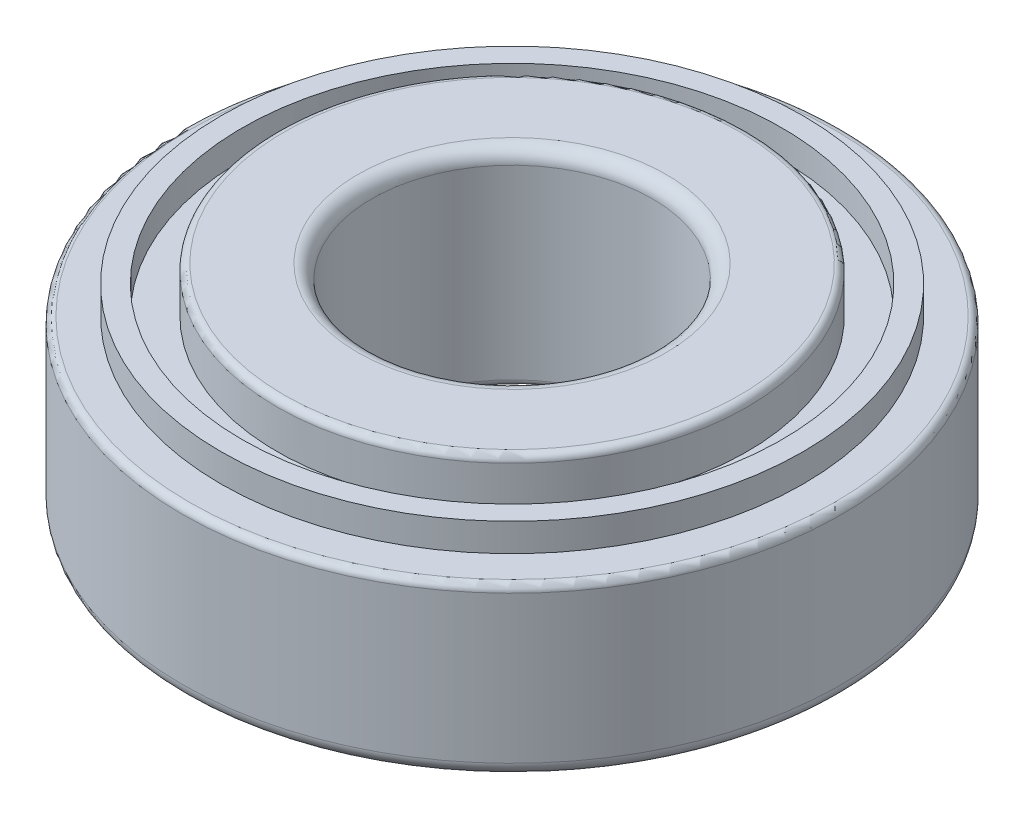
ISO-10303-21;
HEADER;
FILE_DESCRIPTION(('STEP AP214'),'2;1');
FILE_NAME('part.step','',(''),(''),'','','');
FILE_SCHEMA(('AUTOMOTIVE_DESIGN { 1 0 10303 214 1 1 1 1 }'));
ENDSEC;
DATA;
#1=APPLICATION_CONTEXT('core data for automotive mechanical design processes');
#2=APPLICATION_PROTOCOL_DEFINITION('international standard','automotive_design',2000,#1);
#3=PRODUCT_CONTEXT('',#1,'mechanical');
#4=PRODUCT('Part','Part','',(#3));
#5=PRODUCT_RELATED_PRODUCT_CATEGORY('part','',(#4));
#6=PRODUCT_DEFINITION_FORMATION('','',#4);
#7=PRODUCT_DEFINITION_CONTEXT('part definition',#1,'design');
#8=PRODUCT_DEFINITION('design','',#6,#7);
#9=PRODUCT_DEFINITION_SHAPE('','',#8);
#10=(LENGTH_UNIT() NAMED_UNIT(*) SI_UNIT(.MILLI.,.METRE.));
#11=(NAMED_UNIT(*) PLANE_ANGLE_UNIT() SI_UNIT($,.RADIAN.));
#12=(NAMED_UNIT(*) SI_UNIT($,.STERADIAN.) SOLID_ANGLE_UNIT());
#13=UNCERTAINTY_MEASURE_WITH_UNIT(LENGTH_MEASURE(1.E-05),#10,'distance_accuracy_value','');
#14=(GEOMETRIC_REPRESENTATION_CONTEXT(3) GLOBAL_UNCERTAINTY_ASSIGNED_CONTEXT((#13)) GLOBAL_UNIT_ASSIGNED_CONTEXT((#10,
#11,#12)) REPRESENTATION_CONTEXT('',''));
#15=CARTESIAN_POINT('',(0.,0.,0.));
#16=DIRECTION('',(0.,0.,1.));
#17=DIRECTION('',(1.,0.,0.));
#18=AXIS2_PLACEMENT_3D('',#15,#16,#17);
#19=CARTESIAN_POINT('',(0.,12.,0.));
#20=DIRECTION('',(0.,1.,0.));
#21=DIRECTION('',(0.,0.,1.));
#22=AXIS2_PLACEMENT_3D('',#19,#20,#21);
#23=PLANE('',#22);
#24=CARTESIAN_POINT('',(0.,12.,0.));
#25=DIRECTION('',(0.,1.,0.));
#26=DIRECTION('',(0.,0.,1.));
#27=AXIS2_PLACEMENT_3D('',#24,#25,#26);
#28=CIRCLE('',#27,16.75);
#29=CARTESIAN_POINT('',(0.,12.,-16.75));
#30=VERTEX_POINT('',#29);
#31=EDGE_CURVE('E73',#30,#30,#28,.T.);
#32=ORIENTED_EDGE('',*,*,#31,.F.);
#33=EDGE_LOOP('',(#32));
#34=FACE_BOUND('',#33,.T.);
#35=CARTESIAN_POINT('',(0.,12.,0.));
#36=DIRECTION('',(0.,1.,0.));
#37=DIRECTION('',(0.,0.,1.));
#38=AXIS2_PLACEMENT_3D('',#35,#36,#37);
#39=CIRCLE('',#38,19.25);
#40=CARTESIAN_POINT('',(0.,12.,19.25));
#41=VERTEX_POINT('',#40);
#42=EDGE_CURVE('E70',#41,#41,#39,.F.);
#43=ORIENTED_EDGE('',*,*,#42,.F.);
#44=EDGE_LOOP('',(#43));
#45=FACE_BOUND('',#44,.T.);
#46=ADVANCED_FACE('F32',(#34,#45),#23,.T.);
#47=CARTESIAN_POINT('',(0.,12.,0.));
#48=DIRECTION('',(0.,-1.,0.));
#49=DIRECTION('',(0.,0.,-1.));
#50=AXIS2_PLACEMENT_3D('',#47,#48,#49);
#51=CYLINDRICAL_SURFACE('',#50,23.5);
#52=CARTESIAN_POINT('',(0.,11.5,0.));
#53=DIRECTION('',(0.,1.,0.));
#54=DIRECTION('',(0.,0.,1.));
#55=AXIS2_PLACEMENT_3D('',#52,#53,#54);
#56=CIRCLE('',#55,23.5);
#57=CARTESIAN_POINT('',(0.,11.5,23.5));
#58=VERTEX_POINT('',#57);
#59=EDGE_CURVE('E43',#58,#58,#56,.F.);
#60=ORIENTED_EDGE('',*,*,#59,.T.);
#61=EDGE_LOOP('',(#60));
#62=FACE_BOUND('',#61,.T.);
#63=CARTESIAN_POINT('',(0.,1.,0.));
#64=DIRECTION('',(0.,1.,0.));
#65=DIRECTION('',(0.,0.,1.));
#66=AXIS2_PLACEMENT_3D('',#63,#64,#65);
#67=CIRCLE('',#66,23.5);
#68=CARTESIAN_POINT('',(0.,1.,23.5));
#69=VERTEX_POINT('',#68);
#70=EDGE_CURVE('E67',#69,#69,#67,.T.);
#71=ORIENTED_EDGE('',*,*,#70,.T.);
#72=EDGE_LOOP('',(#71));
#73=FACE_BOUND('',#72,.T.);
#74=ADVANCED_FACE('F117',(#62,#73),#51,.T.);
#75=CARTESIAN_POINT('',(0.,12.,0.));
#76=DIRECTION('',(0.,1.,0.));
#77=DIRECTION('',(0.,0.,1.));
#78=AXIS2_PLACEMENT_3D('',#75,#76,#77);
#79=CIRCLE('',#78,23.);
#80=CARTESIAN_POINT('',(0.,12.,23.));
#81=VERTEX_POINT('',#80);
#82=EDGE_CURVE('E47',#81,#81,#79,.T.);
#83=ORIENTED_EDGE('',*,*,#82,.T.);
#84=EDGE_LOOP('',(#83));
#85=FACE_BOUND('',#84,.T.);
#86=CARTESIAN_POINT('',(0.,12.,0.));
#87=DIRECTION('',(0.,1.,0.));
#88=DIRECTION('',(0.,0.,1.));
#89=AXIS2_PLACEMENT_3D('',#86,#87,#88);
#90=CIRCLE('',#89,20.75);
#91=CARTESIAN_POINT('',(0.,12.,20.75));
#92=VERTEX_POINT('',#91);
#93=EDGE_CURVE('E77',#92,#92,#90,.T.);
#94=ORIENTED_EDGE('',*,*,#93,.F.);
#95=EDGE_LOOP('',(#94));
#96=FACE_BOUND('',#95,.T.);
#97=ADVANCED_FACE('F105',(#85,#96),#23,.T.);
#98=CARTESIAN_POINT('',(0.,0.,0.));
#99=DIRECTION('',(0.,1.,0.));
#100=DIRECTION('',(0.,0.,1.));
#101=AXIS2_PLACEMENT_3D('',#98,#99,#100);
#102=PLANE('',#101);
#103=CARTESIAN_POINT('',(0.,0.,0.));
#104=DIRECTION('',(0.,-1.,0.));
#105=DIRECTION('',(0.,0.,-1.));
#106=AXIS2_PLACEMENT_3D('',#103,#104,#105);
#107=CIRCLE('',#106,18.5);
#108=CARTESIAN_POINT('',(0.,0.,-18.5));
#109=VERTEX_POINT('',#108);
#110=EDGE_CURVE('E86',#109,#109,#107,.T.);
#111=ORIENTED_EDGE('',*,*,#110,.F.);
#112=EDGE_LOOP('',(#111));
#113=FACE_BOUND('',#112,.T.);
#114=CARTESIAN_POINT('',(0.,0.,0.));
#115=DIRECTION('',(0.,1.,0.));
#116=DIRECTION('',(0.,0.,1.));
#117=AXIS2_PLACEMENT_3D('',#114,#115,#116);
#118=CIRCLE('',#117,22.5);
#119=CARTESIAN_POINT('',(0.,0.,22.5));
#120=VERTEX_POINT('',#119);
#121=EDGE_CURVE('E64',#120,#120,#118,.F.);
#122=ORIENTED_EDGE('',*,*,#121,.T.);
#123=EDGE_LOOP('',(#122));
#124=FACE_BOUND('',#123,.T.);
#125=ADVANCED_FACE('F101',(#113,#124),#102,.F.);
#126=CARTESIAN_POINT('',(0.,15.25,0.));
#127=DIRECTION('',(0.,-1.,0.));
#128=DIRECTION('',(0.,0.,-1.));
#129=AXIS2_PLACEMENT_3D('',#126,#127,#128);
#130=CYLINDRICAL_SURFACE('',#129,16.75);
#131=CARTESIAN_POINT('',(0.,14.75,0.));
#132=DIRECTION('',(0.,1.,0.));
#133=DIRECTION('',(0.,0.,1.));
#134=AXIS2_PLACEMENT_3D('',#131,#132,#133);
#135=CIRCLE('',#134,16.75);
#136=CARTESIAN_POINT('',(0.,14.75,-16.75));
#137=VERTEX_POINT('',#136);
#138=EDGE_CURVE('E52',#137,#137,#135,.F.);
#139=CARTESIAN_POINT('',(0.,14.75,-16.75));
#140=CARTESIAN_POINT('',(0.,14.7213541666667,-16.75));
#141=CARTESIAN_POINT('',(0.,14.6927083333333,-16.75));
#142=CARTESIAN_POINT('',(0.,14.6354166666667,-16.75));
#143=CARTESIAN_POINT('',(0.,14.6067708333333,-16.75));
#144=CARTESIAN_POINT('',(0.,14.5494791666667,-16.75));
#145=CARTESIAN_POINT('',(0.,14.5208333333333,-16.75));
#146=CARTESIAN_POINT('',(0.,14.4635416666667,-16.75));
#147=CARTESIAN_POINT('',(0.,14.4348958333333,-16.75));
#148=CARTESIAN_POINT('',(0.,14.3776041666667,-16.75));
#149=CARTESIAN_POINT('',(0.,14.3489583333333,-16.75));
#150=CARTESIAN_POINT('',(0.,14.2916666666667,-16.75));
#151=CARTESIAN_POINT('',(0.,14.2630208333333,-16.75));
#152=CARTESIAN_POINT('',(0.,14.2057291666667,-16.75));
#153=CARTESIAN_POINT('',(0.,14.1770833333333,-16.75));
#154=CARTESIAN_POINT('',(0.,14.1197916666667,-16.75));
#155=CARTESIAN_POINT('',(0.,14.0911458333333,-16.75));
#156=CARTESIAN_POINT('',(0.,14.0338541666667,-16.75));
#157=CARTESIAN_POINT('',(0.,14.0052083333333,-16.75));
#158=CARTESIAN_POINT('',(0.,13.9479166666667,-16.75));
#159=CARTESIAN_POINT('',(0.,13.9192708333333,-16.75));
#160=CARTESIAN_POINT('',(0.,13.8619791666667,-16.75));
#161=CARTESIAN_POINT('',(0.,13.8333333333333,-16.75));
#162=CARTESIAN_POINT('',(0.,13.7760416666667,-16.75));
#163=CARTESIAN_POINT('',(0.,13.7473958333333,-16.75));
#164=CARTESIAN_POINT('',(0.,13.6901041666667,-16.75));
#165=CARTESIAN_POINT('',(0.,13.6614583333333,-16.75));
#166=CARTESIAN_POINT('',(0.,13.6041666666667,-16.75));
#167=CARTESIAN_POINT('',(0.,13.5755208333333,-16.75));
#168=CARTESIAN_POINT('',(0.,13.5182291666667,-16.75));
#169=CARTESIAN_POINT('',(0.,13.4895833333333,-16.75));
#170=CARTESIAN_POINT('',(0.,13.4322916666667,-16.75));
#171=CARTESIAN_POINT('',(0.,13.4036458333333,-16.75));
#172=CARTESIAN_POINT('',(0.,13.3463541666667,-16.75));
#173=CARTESIAN_POINT('',(0.,13.3177083333333,-16.75));
#174=CARTESIAN_POINT('',(0.,13.2604166666667,-16.75));
#175=CARTESIAN_POINT('',(0.,13.2317708333333,-16.75));
#176=CARTESIAN_POINT('',(0.,13.1744791666667,-16.75));
#177=CARTESIAN_POINT('',(0.,13.1458333333333,-16.75));
#178=CARTESIAN_POINT('',(0.,13.0885416666667,-16.75));
#179=CARTESIAN_POINT('',(0.,13.0598958333333,-16.75));
#180=CARTESIAN_POINT('',(0.,13.0026041666667,-16.75));
#181=CARTESIAN_POINT('',(0.,12.9739583333333,-16.75));
#182=CARTESIAN_POINT('',(0.,12.9166666666667,-16.75));
#183=CARTESIAN_POINT('',(0.,12.8880208333333,-16.75));
#184=CARTESIAN_POINT('',(0.,12.8307291666667,-16.75));
#185=CARTESIAN_POINT('',(0.,12.8020833333333,-16.75));
#186=CARTESIAN_POINT('',(0.,12.7447916666667,-16.75));
#187=CARTESIAN_POINT('',(0.,12.7161458333333,-16.75));
#188=CARTESIAN_POINT('',(0.,12.6588541666667,-16.75));
#189=CARTESIAN_POINT('',(0.,12.6302083333333,-16.75));
#190=CARTESIAN_POINT('',(0.,12.5729166666667,-16.75));
#191=CARTESIAN_POINT('',(0.,12.5442708333333,-16.75));
#192=CARTESIAN_POINT('',(0.,12.4869791666667,-16.75));
#193=CARTESIAN_POINT('',(0.,12.4583333333333,-16.75));
#194=CARTESIAN_POINT('',(0.,12.4010416666667,-16.75));
#195=CARTESIAN_POINT('',(0.,12.3723958333333,-16.75));
#196=CARTESIAN_POINT('',(0.,12.3151041666667,-16.75));
#197=CARTESIAN_POINT('',(0.,12.2864583333333,-16.75));
#198=CARTESIAN_POINT('',(0.,12.2291666666667,-16.75));
#199=CARTESIAN_POINT('',(0.,12.2005208333333,-16.75));
#200=CARTESIAN_POINT('',(0.,12.1432291666667,-16.75));
#201=CARTESIAN_POINT('',(0.,12.1145833333333,-16.75));
#202=CARTESIAN_POINT('',(0.,12.0572916666667,-16.75));
#203=CARTESIAN_POINT('',(0.,12.0286458333333,-16.75));
#204=CARTESIAN_POINT('',(0.,12.,-16.75));
#205=B_SPLINE_CURVE_WITH_KNOTS('',3,(#139,#140,#141,#142,#143,#144,#145,#146,#147,#148,#149,
#150,#151,#152,#153,#154,#155,#156,#157,#158,#159,#160,#161,#162,#163,#164,#165,#166,#167,#168,
#169,#170,#171,#172,#173,#174,#175,#176,#177,#178,#179,#180,#181,#182,#183,#184,#185,#186,#187,
#188,#189,#190,#191,#192,#193,#194,#195,#196,#197,#198,#199,#200,#201,#202,#203,#204),
.UNSPECIFIED.,.F.,.F.,(4,2,2,2,2,2,2,2,2,2,2,2,2,2,2,2,2,2,2,2,2,2,2,2,2,2,2,2,2,2,2,2,4),(0.,
0.0859374999999992,0.171874999999998,0.257812499999999,0.343749999999999,0.4296875,
0.515624999999999,0.6015625,0.687499999999999,0.7734375,0.859374999999999,0.945312499999998,
1.03125,1.1171875,1.203125,1.2890625,1.375,1.4609375,1.546875,1.6328125,1.71875,1.8046875,
1.890625,1.9765625,2.0625,2.1484375,2.234375,2.3203125,2.40625,2.4921875,2.578125,2.6640625,
2.75),.UNSPECIFIED.);
#206=EDGE_CURVE('BSEAM104',#137,#30,#205,.T.);
#207=ORIENTED_EDGE('',*,*,#138,.T.);
#208=ORIENTED_EDGE('',*,*,#31,.T.);
#209=ORIENTED_EDGE('',*,*,#206,.T.);
#210=ORIENTED_EDGE('',*,*,#206,.F.);
#211=EDGE_LOOP('',(#207,#209,#208,#210));
#212=FACE_BOUND('',#211,.T.);
#213=ADVANCED_FACE('F104',(#212),#130,.T.);
#214=CARTESIAN_POINT('',(0.,15.25,0.));
#215=DIRECTION('',(0.,1.,0.));
#216=DIRECTION('',(0.,0.,1.));
#217=AXIS2_PLACEMENT_3D('',#214,#215,#216);
#218=PLANE('',#217);
#219=CARTESIAN_POINT('',(0.,15.25,0.));
#220=DIRECTION('',(0.,1.,0.));
#221=DIRECTION('',(0.,0.,1.));
#222=AXIS2_PLACEMENT_3D('',#219,#220,#221);
#223=CIRCLE('',#222,16.25);
#224=CARTESIAN_POINT('',(0.,15.25,16.25));
#225=VERTEX_POINT('',#224);
#226=EDGE_CURVE('E55',#225,#225,#223,.T.);
#227=ORIENTED_EDGE('',*,*,#226,.T.);
#228=EDGE_LOOP('',(#227));
#229=FACE_BOUND('',#228,.T.);
#230=CARTESIAN_POINT('',(0.,15.25,0.));
#231=DIRECTION('',(0.,1.,0.));
#232=DIRECTION('',(0.,0.,1.));
#233=AXIS2_PLACEMENT_3D('',#230,#231,#232);
#234=CIRCLE('',#233,11.);
#235=CARTESIAN_POINT('',(0.,15.25,11.));
#236=VERTEX_POINT('',#235);
#237=EDGE_CURVE('E58',#236,#236,#234,.F.);
#238=ORIENTED_EDGE('',*,*,#237,.T.);
#239=EDGE_LOOP('',(#238));
#240=FACE_BOUND('',#239,.T.);
#241=ADVANCED_FACE('F163',(#229,#240),#218,.T.);
#242=CARTESIAN_POINT('',(0.,0.,0.));
#243=DIRECTION('',(0.,1.,0.));
#244=DIRECTION('',(0.,0.,1.));
#245=AXIS2_PLACEMENT_3D('',#242,#243,#244);
#246=CYLINDRICAL_SURFACE('',#245,10.);
#247=CARTESIAN_POINT('',(0.,1.,0.));
#248=DIRECTION('',(0.,-1.,0.));
#249=DIRECTION('',(0.,0.,-1.));
#250=AXIS2_PLACEMENT_3D('',#247,#248,#249);
#251=CIRCLE('',#250,10.);
#252=CARTESIAN_POINT('',(0.,1.,10.));
#253=VERTEX_POINT('',#252);
#254=EDGE_CURVE('E39',#253,#253,#251,.T.);
#255=CARTESIAN_POINT('',(0.,14.25,0.));
#256=DIRECTION('',(0.,1.,0.));
#257=DIRECTION('',(0.,0.,1.));
#258=AXIS2_PLACEMENT_3D('',#255,#256,#257);
#259=CIRCLE('',#258,10.);
#260=CARTESIAN_POINT('',(0.,14.25,10.));
#261=VERTEX_POINT('',#260);
#262=EDGE_CURVE('E61',#261,#261,#259,.T.);
#263=CARTESIAN_POINT('',(0.,1.,10.));
#264=CARTESIAN_POINT('',(0.,1.13802083333333,10.));
#265=CARTESIAN_POINT('',(0.,1.27604166666667,10.));
#266=CARTESIAN_POINT('',(0.,1.55208333333333,10.));
#267=CARTESIAN_POINT('',(0.,1.69010416666667,10.));
#268=CARTESIAN_POINT('',(0.,1.96614583333333,10.));
#269=CARTESIAN_POINT('',(0.,2.10416666666667,10.));
#270=CARTESIAN_POINT('',(0.,2.38020833333333,10.));
#271=CARTESIAN_POINT('',(0.,2.51822916666667,10.));
#272=CARTESIAN_POINT('',(0.,2.79427083333333,10.));
#273=CARTESIAN_POINT('',(0.,2.93229166666667,10.));
#274=CARTESIAN_POINT('',(0.,3.20833333333333,10.));
#275=CARTESIAN_POINT('',(0.,3.34635416666667,10.));
#276=CARTESIAN_POINT('',(0.,3.62239583333333,10.));
#277=CARTESIAN_POINT('',(0.,3.76041666666667,10.));
#278=CARTESIAN_POINT('',(0.,4.03645833333333,10.));
#279=CARTESIAN_POINT('',(0.,4.17447916666667,10.));
#280=CARTESIAN_POINT('',(0.,4.45052083333333,10.));
#281=CARTESIAN_POINT('',(0.,4.58854166666667,10.));
#282=CARTESIAN_POINT('',(0.,4.86458333333333,10.));
#283=CARTESIAN_POINT('',(0.,5.00260416666667,10.));
#284=CARTESIAN_POINT('',(0.,5.27864583333333,10.));
#285=CARTESIAN_POINT('',(0.,5.41666666666667,10.));
#286=CARTESIAN_POINT('',(0.,5.69270833333333,10.));
#287=CARTESIAN_POINT('',(0.,5.83072916666667,10.));
#288=CARTESIAN_POINT('',(0.,6.10677083333333,10.));
#289=CARTESIAN_POINT('',(0.,6.24479166666667,10.));
#290=CARTESIAN_POINT('',(0.,6.52083333333333,10.));
#291=CARTESIAN_POINT('',(0.,6.65885416666667,10.));
#292=CARTESIAN_POINT('',(0.,6.93489583333333,10.));
#293=CARTESIAN_POINT('',(0.,7.07291666666667,10.));
#294=CARTESIAN_POINT('',(0.,7.34895833333333,10.));
#295=CARTESIAN_POINT('',(0.,7.48697916666667,10.));
#296=CARTESIAN_POINT('',(0.,7.76302083333333,10.));
#297=CARTESIAN_POINT('',(0.,7.90104166666667,10.));
#298=CARTESIAN_POINT('',(0.,8.17708333333333,10.));
#299=CARTESIAN_POINT('',(0.,8.31510416666666,10.));
#300=CARTESIAN_POINT('',(0.,8.59114583333333,10.));
#301=CARTESIAN_POINT('',(0.,8.72916666666666,10.));
#302=CARTESIAN_POINT('',(0.,9.00520833333333,10.));
#303=CARTESIAN_POINT('',(0.,9.14322916666666,10.));
#304=CARTESIAN_POINT('',(0.,9.41927083333333,10.));
#305=CARTESIAN_POINT('',(0.,9.55729166666666,10.));
#306=CARTESIAN_POINT('',(0.,9.83333333333333,10.));
#307=CARTESIAN_POINT('',(0.,9.97135416666666,10.));
#308=CARTESIAN_POINT('',(0.,10.2473958333333,10.));
#309=CARTESIAN_POINT('',(0.,10.3854166666667,10.));
#310=CARTESIAN_POINT('',(0.,10.6614583333333,10.));
#311=CARTESIAN_POINT('',(0.,10.7994791666667,10.));
#312=CARTESIAN_POINT('',(0.,11.0755208333333,10.));
#313=CARTESIAN_POINT('',(0.,11.2135416666667,10.));
#314=CARTESIAN_POINT('',(0.,11.4895833333333,10.));
#315=CARTESIAN_POINT('',(0.,11.6276041666667,10.));
#316=CARTESIAN_POINT('',(0.,11.9036458333333,10.));
#317=CARTESIAN_POINT('',(0.,12.0416666666667,10.));
#318=CARTESIAN_POINT('',(0.,12.3177083333333,10.));
#319=CARTESIAN_POINT('',(0.,12.4557291666667,10.));
#320=CARTESIAN_POINT('',(0.,12.7317708333333,10.));
#321=CARTESIAN_POINT('',(0.,12.8697916666667,10.));
#322=CARTESIAN_POINT('',(0.,13.1458333333333,10.));
#323=CARTESIAN_POINT('',(0.,13.2838541666667,10.));
#324=CARTESIAN_POINT('',(0.,13.5598958333333,10.));
#325=CARTESIAN_POINT('',(0.,13.6979166666667,10.));
#326=CARTESIAN_POINT('',(0.,13.9739583333333,10.));
#327=CARTESIAN_POINT('',(0.,14.1119791666667,10.));
#328=CARTESIAN_POINT('',(0.,14.25,10.));
#329=B_SPLINE_CURVE_WITH_KNOTS('',3,(#263,#264,#265,#266,#267,#268,#269,#270,#271,#272,#273,
#274,#275,#276,#277,#278,#279,#280,#281,#282,#283,#284,#285,#286,#287,#288,#289,#290,#291,#292,
#293,#294,#295,#296,#297,#298,#299,#300,#301,#302,#303,#304,#305,#306,#307,#308,#309,#310,#311,
#312,#313,#314,#315,#316,#317,#318,#319,#320,#321,#322,#323,#324,#325,#326,#327,#328),
.UNSPECIFIED.,.F.,.F.,(4,2,2,2,2,2,2,2,2,2,2,2,2,2,2,2,2,2,2,2,2,2,2,2,2,2,2,2,2,2,2,2,4),(0.,
0.4140625,0.828125,1.2421875,1.65625,2.0703125,2.484375,2.8984375,3.3125,3.7265625,4.140625,
4.5546875,4.96875,5.3828125,5.796875,6.2109375,6.625,7.0390625,7.453125,7.8671875,8.28125,
8.6953125,9.109375,9.5234375,9.9375,10.3515625,10.765625,11.1796875,11.59375,12.0078125,
12.421875,12.8359375,13.25),.UNSPECIFIED.);
#330=EDGE_CURVE('BSEAM156',#253,#261,#329,.T.);
#331=ORIENTED_EDGE('',*,*,#254,.T.);
#332=ORIENTED_EDGE('',*,*,#262,.T.);
#333=ORIENTED_EDGE('',*,*,#330,.T.);
#334=ORIENTED_EDGE('',*,*,#330,.F.);
#335=EDGE_LOOP('',(#331,#333,#332,#334));
#336=FACE_BOUND('',#335,.T.);
#337=ADVANCED_FACE('F156',(#336),#246,.F.);
#338=CARTESIAN_POINT('',(0.,14.,0.));
#339=DIRECTION('',(0.,1.,0.));
#340=DIRECTION('',(0.,0.,1.));
#341=AXIS2_PLACEMENT_3D('',#338,#339,#340);
#342=PLANE('',#341);
#343=CARTESIAN_POINT('',(0.,14.,0.));
#344=DIRECTION('',(0.,1.,0.));
#345=DIRECTION('',(0.,0.,1.));
#346=AXIS2_PLACEMENT_3D('',#343,#344,#345);
#347=CIRCLE('',#346,20.75);
#348=CARTESIAN_POINT('',(0.,14.,20.75));
#349=VERTEX_POINT('',#348);
#350=EDGE_CURVE('E76',#349,#349,#347,.T.);
#351=ORIENTED_EDGE('',*,*,#350,.T.);
#352=EDGE_LOOP('',(#351));
#353=FACE_BOUND('',#352,.T.);
#354=CARTESIAN_POINT('',(0.,14.,0.));
#355=DIRECTION('',(0.,1.,0.));
#356=DIRECTION('',(0.,0.,1.));
#357=AXIS2_PLACEMENT_3D('',#354,#355,#356);
#358=CIRCLE('',#357,19.25);
#359=CARTESIAN_POINT('',(0.,14.,19.25));
#360=VERTEX_POINT('',#359);
#361=EDGE_CURVE('E80',#360,#360,#358,.T.);
#362=ORIENTED_EDGE('',*,*,#361,.F.);
#363=EDGE_LOOP('',(#362));
#364=FACE_BOUND('',#363,.T.);
#365=ADVANCED_FACE('F147',(#353,#364),#342,.T.);
#366=CARTESIAN_POINT('',(0.,14.,0.));
#367=DIRECTION('',(0.,-1.,0.));
#368=DIRECTION('',(0.,0.,-1.));
#369=AXIS2_PLACEMENT_3D('',#366,#367,#368);
#370=CYLINDRICAL_SURFACE('',#369,20.75);
#371=ORIENTED_EDGE('',*,*,#350,.F.);
#372=EDGE_LOOP('',(#371));
#373=FACE_BOUND('',#372,.T.);
#374=ORIENTED_EDGE('',*,*,#93,.T.);
#375=EDGE_LOOP('',(#374));
#376=FACE_BOUND('',#375,.T.);
#377=ADVANCED_FACE('F145',(#373,#376),#370,.T.);
#378=CARTESIAN_POINT('',(0.,14.,0.));
#379=DIRECTION('',(0.,-1.,0.));
#380=DIRECTION('',(0.,0.,-1.));
#381=AXIS2_PLACEMENT_3D('',#378,#379,#380);
#382=CYLINDRICAL_SURFACE('',#381,19.25);
#383=ORIENTED_EDGE('',*,*,#361,.T.);
#384=EDGE_LOOP('',(#383));
#385=FACE_BOUND('',#384,.T.);
#386=ORIENTED_EDGE('',*,*,#42,.T.);
#387=EDGE_LOOP('',(#386));
#388=FACE_BOUND('',#387,.T.);
#389=ADVANCED_FACE('F113',(#385,#388),#382,.F.);
#390=CARTESIAN_POINT('',(0.,1.,0.));
#391=DIRECTION('',(0.,1.,0.));
#392=DIRECTION('',(0.,0.,1.));
#393=AXIS2_PLACEMENT_3D('',#390,#391,#392);
#394=TOROIDAL_SURFACE('',#393,22.5,1.);
#395=ORIENTED_EDGE('',*,*,#121,.F.);
#396=EDGE_LOOP('',(#395));
#397=FACE_BOUND('',#396,.T.);
#398=ORIENTED_EDGE('',*,*,#70,.F.);
#399=EDGE_LOOP('',(#398));
#400=FACE_BOUND('',#399,.T.);
#401=ADVANCED_FACE('F109',(#397,#400),#394,.T.);
#402=CARTESIAN_POINT('',(0.,14.25,0.));
#403=DIRECTION('',(0.,1.,0.));
#404=DIRECTION('',(0.,0.,1.));
#405=AXIS2_PLACEMENT_3D('',#402,#403,#404);
#406=TOROIDAL_SURFACE('',#405,11.,1.);
#407=ORIENTED_EDGE('',*,*,#237,.F.);
#408=EDGE_LOOP('',(#407));
#409=FACE_BOUND('',#408,.T.);
#410=ORIENTED_EDGE('',*,*,#262,.F.);
#411=EDGE_LOOP('',(#410));
#412=FACE_BOUND('',#411,.T.);
#413=ADVANCED_FACE('F112',(#409,#412),#406,.T.);
#414=CARTESIAN_POINT('',(0.,14.75,0.));
#415=DIRECTION('',(0.,1.,0.));
#416=DIRECTION('',(0.,0.,1.));
#417=AXIS2_PLACEMENT_3D('',#414,#415,#416);
#418=TOROIDAL_SURFACE('',#417,16.25,0.5);
#419=ORIENTED_EDGE('',*,*,#138,.F.);
#420=EDGE_LOOP('',(#419));
#421=FACE_BOUND('',#420,.T.);
#422=ORIENTED_EDGE('',*,*,#226,.F.);
#423=EDGE_LOOP('',(#422));
#424=FACE_BOUND('',#423,.T.);
#425=ADVANCED_FACE('F131',(#421,#424),#418,.T.);
#426=CARTESIAN_POINT('',(0.,11.5,0.));
#427=DIRECTION('',(0.,1.,0.));
#428=DIRECTION('',(0.,0.,1.));
#429=AXIS2_PLACEMENT_3D('',#426,#427,#428);
#430=TOROIDAL_SURFACE('',#429,23.,0.5);
#431=ORIENTED_EDGE('',*,*,#59,.F.);
#432=EDGE_LOOP('',(#431));
#433=FACE_BOUND('',#432,.T.);
#434=ORIENTED_EDGE('',*,*,#82,.F.);
#435=EDGE_LOOP('',(#434));
#436=FACE_BOUND('',#435,.T.);
#437=ADVANCED_FACE('F97',(#433,#436),#430,.T.);
#438=CARTESIAN_POINT('',(0.,0.5,0.));
#439=DIRECTION('',(0.,-1.,0.));
#440=DIRECTION('',(0.,0.,-1.));
#441=AXIS2_PLACEMENT_3D('',#438,#439,#440);
#442=CYLINDRICAL_SURFACE('',#441,18.5);
#443=CARTESIAN_POINT('',(0.,0.5,0.));
#444=DIRECTION('',(0.,-1.,0.));
#445=DIRECTION('',(0.,0.,-1.));
#446=AXIS2_PLACEMENT_3D('',#443,#444,#445);
#447=CIRCLE('',#446,18.5);
#448=CARTESIAN_POINT('',(0.,0.5,-18.5));
#449=VERTEX_POINT('',#448);
#450=EDGE_CURVE('E85',#449,#449,#447,.T.);
#451=ORIENTED_EDGE('',*,*,#450,.F.);
#452=EDGE_LOOP('',(#451));
#453=FACE_BOUND('',#452,.T.);
#454=ORIENTED_EDGE('',*,*,#110,.T.);
#455=EDGE_LOOP('',(#454));
#456=FACE_BOUND('',#455,.T.);
#457=ADVANCED_FACE('F94',(#453,#456),#442,.F.);
#458=CARTESIAN_POINT('',(0.,0.5,0.));
#459=DIRECTION('',(0.,-1.,0.));
#460=DIRECTION('',(0.,0.,-1.));
#461=AXIS2_PLACEMENT_3D('',#458,#459,#460);
#462=PLANE('',#461);
#463=CARTESIAN_POINT('',(0.,0.5,0.));
#464=DIRECTION('',(0.,-1.,0.));
#465=DIRECTION('',(0.,0.,-1.));
#466=AXIS2_PLACEMENT_3D('',#463,#464,#465);
#467=CIRCLE('',#466,10.5);
#468=CARTESIAN_POINT('',(0.,0.5,-10.5));
#469=VERTEX_POINT('',#468);
#470=EDGE_CURVE('E10',#469,#469,#467,.F.);
#471=ORIENTED_EDGE('',*,*,#470,.T.);
#472=EDGE_LOOP('',(#471));
#473=FACE_BOUND('',#472,.T.);
#474=ORIENTED_EDGE('',*,*,#450,.T.);
#475=EDGE_LOOP('',(#474));
#476=FACE_BOUND('',#475,.T.);
#477=ADVANCED_FACE('F92',(#473,#476),#462,.T.);
#478=CARTESIAN_POINT('',(0.,1.,0.));
#479=DIRECTION('',(0.,-1.,0.));
#480=DIRECTION('',(0.,0.,-1.));
#481=AXIS2_PLACEMENT_3D('',#478,#479,#480);
#482=TOROIDAL_SURFACE('',#481,10.5,0.5);
#483=ORIENTED_EDGE('',*,*,#470,.F.);
#484=EDGE_LOOP('',(#483));
#485=FACE_BOUND('',#484,.T.);
#486=ORIENTED_EDGE('',*,*,#254,.F.);
#487=EDGE_LOOP('',(#486));
#488=FACE_BOUND('',#487,.T.);
#489=ADVANCED_FACE('F34',(#485,#488),#482,.T.);
#490=CLOSED_SHELL('',(#46,#74,#97,#125,#213,#241,#337,#365,#377,#389,#401,#413,#425,#437,#457,
#477,#489));
#491=MANIFOLD_SOLID_BREP('B2',#490);
#492=ADVANCED_BREP_SHAPE_REPRESENTATION('',(#18,#491),#14);
#493=SHAPE_DEFINITION_REPRESENTATION(#9,#492);
ENDSEC;
END-ISO-10303-21;
